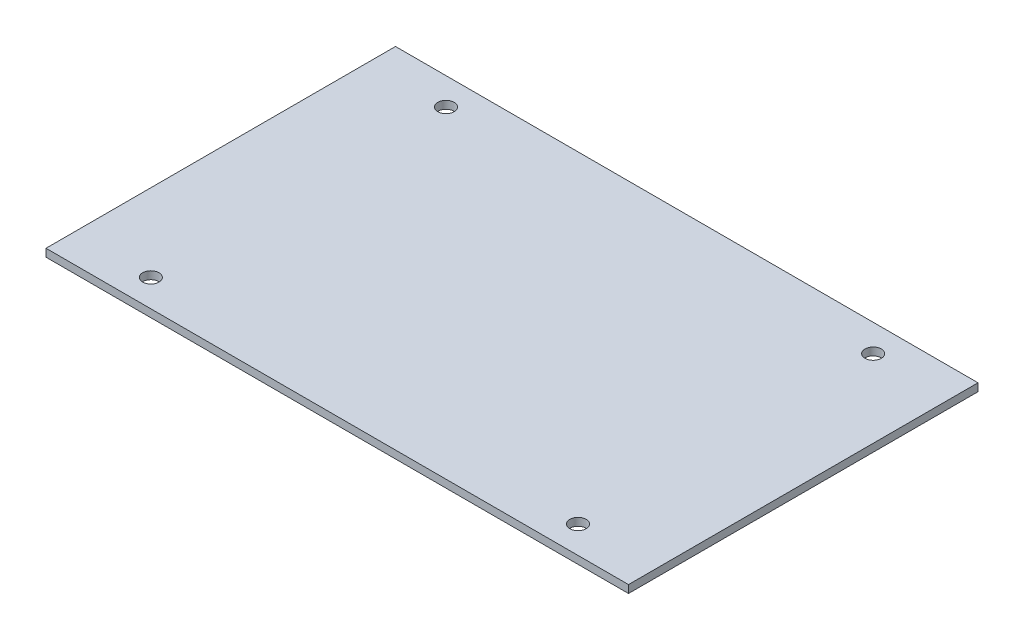
ISO-10303-21;
HEADER;
FILE_DESCRIPTION(('STEP AP214'),'2;1');
FILE_NAME('part.step','',(''),(''),'','','');
FILE_SCHEMA(('AUTOMOTIVE_DESIGN { 1 0 10303 214 1 1 1 1 }'));
ENDSEC;
DATA;
#1=APPLICATION_CONTEXT('core data for automotive mechanical design processes');
#2=APPLICATION_PROTOCOL_DEFINITION('international standard','automotive_design',2000,#1);
#3=PRODUCT_CONTEXT('',#1,'mechanical');
#4=PRODUCT('Part','Part','',(#3));
#5=PRODUCT_RELATED_PRODUCT_CATEGORY('part','',(#4));
#6=PRODUCT_DEFINITION_FORMATION('','',#4);
#7=PRODUCT_DEFINITION_CONTEXT('part definition',#1,'design');
#8=PRODUCT_DEFINITION('design','',#6,#7);
#9=PRODUCT_DEFINITION_SHAPE('','',#8);
#10=(LENGTH_UNIT() NAMED_UNIT(*) SI_UNIT(.MILLI.,.METRE.));
#11=(NAMED_UNIT(*) PLANE_ANGLE_UNIT() SI_UNIT($,.RADIAN.));
#12=(NAMED_UNIT(*) SI_UNIT($,.STERADIAN.) SOLID_ANGLE_UNIT());
#13=UNCERTAINTY_MEASURE_WITH_UNIT(LENGTH_MEASURE(1.E-05),#10,'distance_accuracy_value','');
#14=(GEOMETRIC_REPRESENTATION_CONTEXT(3) GLOBAL_UNCERTAINTY_ASSIGNED_CONTEXT((#13)) GLOBAL_UNIT_ASSIGNED_CONTEXT((#10,
#11,#12)) REPRESENTATION_CONTEXT('',''));
#15=CARTESIAN_POINT('',(0.,0.,0.));
#16=DIRECTION('',(0.,0.,1.));
#17=DIRECTION('',(1.,0.,0.));
#18=AXIS2_PLACEMENT_3D('',#15,#16,#17);
#19=CARTESIAN_POINT('',(0.,2.,0.));
#20=DIRECTION('',(0.,-1.,0.));
#21=DIRECTION('',(0.,0.,-1.));
#22=AXIS2_PLACEMENT_3D('',#19,#20,#21);
#23=PLANE('',#22);
#24=DIRECTION('',(0.,0.,-1.));
#25=VECTOR('',#24,1.);
#26=CARTESIAN_POINT('',(74.9999999999999,2.,45.));
#27=LINE('',#26,#25);
#28=CARTESIAN_POINT('',(74.9999999999999,2.,45.));
#29=VERTEX_POINT('',#28);
#30=CARTESIAN_POINT('',(74.9999999999999,2.,-45.));
#31=VERTEX_POINT('',#30);
#32=EDGE_CURVE('E86',#29,#31,#27,.T.);
#33=ORIENTED_EDGE('',*,*,#32,.T.);
#34=DIRECTION('',(-1.,0.,0.));
#35=VECTOR('',#34,1.);
#36=CARTESIAN_POINT('',(-75.0000000000001,2.,-45.));
#37=LINE('',#36,#35);
#38=CARTESIAN_POINT('',(-75.0000000000001,2.,-45.));
#39=VERTEX_POINT('',#38);
#40=EDGE_CURVE('E81',#31,#39,#37,.T.);
#41=ORIENTED_EDGE('',*,*,#40,.T.);
#42=DIRECTION('',(0.,0.,1.));
#43=VECTOR('',#42,1.);
#44=CARTESIAN_POINT('',(-75.0000000000001,2.,45.));
#45=LINE('',#44,#43);
#46=CARTESIAN_POINT('',(-75.0000000000001,2.,45.));
#47=VERTEX_POINT('',#46);
#48=EDGE_CURVE('E84',#39,#47,#45,.T.);
#49=ORIENTED_EDGE('',*,*,#48,.T.);
#50=DIRECTION('',(1.,0.,0.));
#51=VECTOR('',#50,1.);
#52=CARTESIAN_POINT('',(-75.0000000000001,2.,45.));
#53=LINE('',#52,#51);
#54=EDGE_CURVE('E51',#47,#29,#53,.T.);
#55=ORIENTED_EDGE('',*,*,#54,.T.);
#56=EDGE_LOOP('',(#33,#41,#49,#55));
#57=FACE_BOUND('',#56,.T.);
#58=CARTESIAN_POINT('',(-55.,2.,-38.));
#59=DIRECTION('',(0.,1.,0.));
#60=DIRECTION('',(0.,0.,1.));
#61=AXIS2_PLACEMENT_3D('',#58,#59,#60);
#62=CIRCLE('',#61,2.1);
#63=CARTESIAN_POINT('',(-55.,2.,-35.9));
#64=VERTEX_POINT('',#63);
#65=EDGE_CURVE('E101',#64,#64,#62,.T.);
#66=ORIENTED_EDGE('',*,*,#65,.F.);
#67=EDGE_LOOP('',(#66));
#68=FACE_BOUND('',#67,.T.);
#69=CARTESIAN_POINT('',(55.,2.,-38.));
#70=DIRECTION('',(0.,1.,0.));
#71=DIRECTION('',(0.,0.,1.));
#72=AXIS2_PLACEMENT_3D('',#69,#70,#71);
#73=CIRCLE('',#72,2.1);
#74=CARTESIAN_POINT('',(55.,2.,-35.9));
#75=VERTEX_POINT('',#74);
#76=EDGE_CURVE('E116',#75,#75,#73,.T.);
#77=ORIENTED_EDGE('',*,*,#76,.F.);
#78=EDGE_LOOP('',(#77));
#79=FACE_BOUND('',#78,.T.);
#80=CARTESIAN_POINT('',(-55.,2.,38.));
#81=DIRECTION('',(0.,1.,0.));
#82=DIRECTION('',(0.,0.,1.));
#83=AXIS2_PLACEMENT_3D('',#80,#81,#82);
#84=CIRCLE('',#83,2.1);
#85=CARTESIAN_POINT('',(-55.,2.,40.1));
#86=VERTEX_POINT('',#85);
#87=EDGE_CURVE('E122',#86,#86,#84,.T.);
#88=ORIENTED_EDGE('',*,*,#87,.F.);
#89=EDGE_LOOP('',(#88));
#90=FACE_BOUND('',#89,.T.);
#91=CARTESIAN_POINT('',(55.,2.,38.));
#92=DIRECTION('',(0.,1.,0.));
#93=DIRECTION('',(0.,0.,1.));
#94=AXIS2_PLACEMENT_3D('',#91,#92,#93);
#95=CIRCLE('',#94,2.1);
#96=CARTESIAN_POINT('',(55.,2.,40.1));
#97=VERTEX_POINT('',#96);
#98=EDGE_CURVE('E128',#97,#97,#95,.T.);
#99=ORIENTED_EDGE('',*,*,#98,.F.);
#100=EDGE_LOOP('',(#99));
#101=FACE_BOUND('',#100,.T.);
#102=ADVANCED_FACE('F34',(#57,#68,#79,#90,#101),#23,.F.);
#103=CARTESIAN_POINT('',(0.,0.,0.));
#104=DIRECTION('',(0.,-1.,0.));
#105=DIRECTION('',(0.,0.,-1.));
#106=AXIS2_PLACEMENT_3D('',#103,#104,#105);
#107=PLANE('',#106);
#108=CARTESIAN_POINT('',(-55.,0.,38.));
#109=DIRECTION('',(0.,1.,0.));
#110=DIRECTION('',(0.,0.,1.));
#111=AXIS2_PLACEMENT_3D('',#108,#109,#110);
#112=CIRCLE('',#111,2.1);
#113=CARTESIAN_POINT('',(-55.,0.,40.1));
#114=VERTEX_POINT('',#113);
#115=EDGE_CURVE('E125',#114,#114,#112,.T.);
#116=ORIENTED_EDGE('',*,*,#115,.T.);
#117=EDGE_LOOP('',(#116));
#118=FACE_BOUND('',#117,.T.);
#119=CARTESIAN_POINT('',(-55.,0.,-38.));
#120=DIRECTION('',(0.,1.,0.));
#121=DIRECTION('',(0.,0.,1.));
#122=AXIS2_PLACEMENT_3D('',#119,#120,#121);
#123=CIRCLE('',#122,2.1);
#124=CARTESIAN_POINT('',(-55.,0.,-35.9));
#125=VERTEX_POINT('',#124);
#126=EDGE_CURVE('E113',#125,#125,#123,.T.);
#127=ORIENTED_EDGE('',*,*,#126,.T.);
#128=EDGE_LOOP('',(#127));
#129=FACE_BOUND('',#128,.T.);
#130=DIRECTION('',(0.,0.,-1.));
#131=VECTOR('',#130,1.);
#132=CARTESIAN_POINT('',(74.9999999999999,0.,45.));
#133=LINE('',#132,#131);
#134=CARTESIAN_POINT('',(74.9999999999999,0.,45.));
#135=VERTEX_POINT('',#134);
#136=CARTESIAN_POINT('',(74.9999999999999,0.,-45.));
#137=VERTEX_POINT('',#136);
#138=EDGE_CURVE('E98',#135,#137,#133,.T.);
#139=ORIENTED_EDGE('',*,*,#138,.F.);
#140=DIRECTION('',(1.,0.,0.));
#141=VECTOR('',#140,1.);
#142=CARTESIAN_POINT('',(-75.0000000000001,0.,45.));
#143=LINE('',#142,#141);
#144=CARTESIAN_POINT('',(-75.0000000000001,0.,45.));
#145=VERTEX_POINT('',#144);
#146=EDGE_CURVE('E74',#145,#135,#143,.T.);
#147=ORIENTED_EDGE('',*,*,#146,.F.);
#148=DIRECTION('',(0.,0.,1.));
#149=VECTOR('',#148,1.);
#150=CARTESIAN_POINT('',(-75.0000000000001,0.,45.));
#151=LINE('',#150,#149);
#152=CARTESIAN_POINT('',(-75.0000000000001,0.,-45.));
#153=VERTEX_POINT('',#152);
#154=EDGE_CURVE('E68',#153,#145,#151,.T.);
#155=ORIENTED_EDGE('',*,*,#154,.F.);
#156=DIRECTION('',(-1.,0.,0.));
#157=VECTOR('',#156,1.);
#158=CARTESIAN_POINT('',(-75.0000000000001,0.,-45.));
#159=LINE('',#158,#157);
#160=EDGE_CURVE('E90',#137,#153,#159,.T.);
#161=ORIENTED_EDGE('',*,*,#160,.F.);
#162=EDGE_LOOP('',(#139,#147,#155,#161));
#163=FACE_BOUND('',#162,.T.);
#164=CARTESIAN_POINT('',(55.,0.,-38.));
#165=DIRECTION('',(0.,1.,0.));
#166=DIRECTION('',(0.,0.,1.));
#167=AXIS2_PLACEMENT_3D('',#164,#165,#166);
#168=CIRCLE('',#167,2.1);
#169=CARTESIAN_POINT('',(55.,0.,-35.9));
#170=VERTEX_POINT('',#169);
#171=EDGE_CURVE('E119',#170,#170,#168,.T.);
#172=ORIENTED_EDGE('',*,*,#171,.T.);
#173=EDGE_LOOP('',(#172));
#174=FACE_BOUND('',#173,.T.);
#175=CARTESIAN_POINT('',(55.,0.,38.));
#176=DIRECTION('',(0.,1.,0.));
#177=DIRECTION('',(0.,0.,1.));
#178=AXIS2_PLACEMENT_3D('',#175,#176,#177);
#179=CIRCLE('',#178,2.1);
#180=CARTESIAN_POINT('',(55.,0.,40.1));
#181=VERTEX_POINT('',#180);
#182=EDGE_CURVE('E131',#181,#181,#179,.T.);
#183=ORIENTED_EDGE('',*,*,#182,.T.);
#184=EDGE_LOOP('',(#183));
#185=FACE_BOUND('',#184,.T.);
#186=ADVANCED_FACE('F109',(#118,#129,#163,#174,#185),#107,.T.);
#187=CARTESIAN_POINT('',(74.9999999999999,2.,45.));
#188=DIRECTION('',(-1.,0.,0.));
#189=DIRECTION('',(0.,0.,1.));
#190=AXIS2_PLACEMENT_3D('',#187,#188,#189);
#191=PLANE('',#190);
#192=ORIENTED_EDGE('',*,*,#138,.T.);
#193=DIRECTION('',(0.,-1.,0.));
#194=VECTOR('',#193,1.);
#195=CARTESIAN_POINT('',(74.9999999999999,2.,-45.));
#196=LINE('',#195,#194);
#197=EDGE_CURVE('E11',#31,#137,#196,.T.);
#198=ORIENTED_EDGE('',*,*,#197,.F.);
#199=ORIENTED_EDGE('',*,*,#32,.F.);
#200=DIRECTION('',(0.,-1.,0.));
#201=VECTOR('',#200,1.);
#202=CARTESIAN_POINT('',(74.9999999999999,2.,45.));
#203=LINE('',#202,#201);
#204=EDGE_CURVE('E94',#29,#135,#203,.T.);
#205=ORIENTED_EDGE('',*,*,#204,.T.);
#206=EDGE_LOOP('',(#192,#198,#199,#205));
#207=FACE_BOUND('',#206,.T.);
#208=ADVANCED_FACE('F36',(#207),#191,.F.);
#209=CARTESIAN_POINT('',(-75.0000000000001,2.,-45.));
#210=DIRECTION('',(0.,0.,1.));
#211=DIRECTION('',(1.,0.,0.));
#212=AXIS2_PLACEMENT_3D('',#209,#210,#211);
#213=PLANE('',#212);
#214=ORIENTED_EDGE('',*,*,#160,.T.);
#215=DIRECTION('',(0.,-1.,0.));
#216=VECTOR('',#215,1.);
#217=CARTESIAN_POINT('',(-75.0000000000001,2.,-45.));
#218=LINE('',#217,#216);
#219=EDGE_CURVE('E43',#39,#153,#218,.T.);
#220=ORIENTED_EDGE('',*,*,#219,.F.);
#221=ORIENTED_EDGE('',*,*,#40,.F.);
#222=ORIENTED_EDGE('',*,*,#197,.T.);
#223=EDGE_LOOP('',(#214,#220,#221,#222));
#224=FACE_BOUND('',#223,.T.);
#225=ADVANCED_FACE('F89',(#224),#213,.F.);
#226=CARTESIAN_POINT('',(-75.0000000000001,2.,45.));
#227=DIRECTION('',(1.,0.,0.));
#228=DIRECTION('',(0.,0.,-1.));
#229=AXIS2_PLACEMENT_3D('',#226,#227,#228);
#230=PLANE('',#229);
#231=ORIENTED_EDGE('',*,*,#154,.T.);
#232=DIRECTION('',(0.,-1.,0.));
#233=VECTOR('',#232,1.);
#234=CARTESIAN_POINT('',(-75.0000000000001,2.,45.));
#235=LINE('',#234,#233);
#236=EDGE_CURVE('E91',#47,#145,#235,.T.);
#237=ORIENTED_EDGE('',*,*,#236,.F.);
#238=ORIENTED_EDGE('',*,*,#48,.F.);
#239=ORIENTED_EDGE('',*,*,#219,.T.);
#240=EDGE_LOOP('',(#231,#237,#238,#239));
#241=FACE_BOUND('',#240,.T.);
#242=ADVANCED_FACE('F92',(#241),#230,.F.);
#243=CARTESIAN_POINT('',(-75.0000000000001,2.,45.));
#244=DIRECTION('',(0.,0.,-1.));
#245=DIRECTION('',(-1.,0.,0.));
#246=AXIS2_PLACEMENT_3D('',#243,#244,#245);
#247=PLANE('',#246);
#248=ORIENTED_EDGE('',*,*,#146,.T.);
#249=ORIENTED_EDGE('',*,*,#204,.F.);
#250=ORIENTED_EDGE('',*,*,#54,.F.);
#251=ORIENTED_EDGE('',*,*,#236,.T.);
#252=EDGE_LOOP('',(#248,#249,#250,#251));
#253=FACE_BOUND('',#252,.T.);
#254=ADVANCED_FACE('F106',(#253),#247,.F.);
#255=CARTESIAN_POINT('',(-55.,2.,-38.));
#256=DIRECTION('',(0.,-1.,0.));
#257=DIRECTION('',(0.,0.,-1.));
#258=AXIS2_PLACEMENT_3D('',#255,#256,#257);
#259=CYLINDRICAL_SURFACE('',#258,2.1);
#260=ORIENTED_EDGE('',*,*,#65,.T.);
#261=EDGE_LOOP('',(#260));
#262=FACE_BOUND('',#261,.T.);
#263=ORIENTED_EDGE('',*,*,#126,.F.);
#264=EDGE_LOOP('',(#263));
#265=FACE_BOUND('',#264,.T.);
#266=ADVANCED_FACE('F148',(#262,#265),#259,.F.);
#267=CARTESIAN_POINT('',(55.,2.,-38.));
#268=DIRECTION('',(0.,-1.,0.));
#269=DIRECTION('',(0.,0.,-1.));
#270=AXIS2_PLACEMENT_3D('',#267,#268,#269);
#271=CYLINDRICAL_SURFACE('',#270,2.1);
#272=ORIENTED_EDGE('',*,*,#76,.T.);
#273=EDGE_LOOP('',(#272));
#274=FACE_BOUND('',#273,.T.);
#275=ORIENTED_EDGE('',*,*,#171,.F.);
#276=EDGE_LOOP('',(#275));
#277=FACE_BOUND('',#276,.T.);
#278=ADVANCED_FACE('F194',(#274,#277),#271,.F.);
#279=CARTESIAN_POINT('',(-55.,2.,38.));
#280=DIRECTION('',(0.,-1.,0.));
#281=DIRECTION('',(0.,0.,-1.));
#282=AXIS2_PLACEMENT_3D('',#279,#280,#281);
#283=CYLINDRICAL_SURFACE('',#282,2.1);
#284=ORIENTED_EDGE('',*,*,#87,.T.);
#285=EDGE_LOOP('',(#284));
#286=FACE_BOUND('',#285,.T.);
#287=ORIENTED_EDGE('',*,*,#115,.F.);
#288=EDGE_LOOP('',(#287));
#289=FACE_BOUND('',#288,.T.);
#290=ADVANCED_FACE('F202',(#286,#289),#283,.F.);
#291=CARTESIAN_POINT('',(55.,2.,38.));
#292=DIRECTION('',(0.,-1.,0.));
#293=DIRECTION('',(0.,0.,-1.));
#294=AXIS2_PLACEMENT_3D('',#291,#292,#293);
#295=CYLINDRICAL_SURFACE('',#294,2.1);
#296=ORIENTED_EDGE('',*,*,#98,.T.);
#297=EDGE_LOOP('',(#296));
#298=FACE_BOUND('',#297,.T.);
#299=ORIENTED_EDGE('',*,*,#182,.F.);
#300=EDGE_LOOP('',(#299));
#301=FACE_BOUND('',#300,.T.);
#302=ADVANCED_FACE('F137',(#298,#301),#295,.F.);
#303=CLOSED_SHELL('',(#102,#186,#208,#225,#242,#254,#266,#278,#290,#302));
#304=MANIFOLD_SOLID_BREP('B2',#303);
#305=ADVANCED_BREP_SHAPE_REPRESENTATION('',(#18,#304),#14);
#306=SHAPE_DEFINITION_REPRESENTATION(#9,#305);
ENDSEC;
END-ISO-10303-21;
